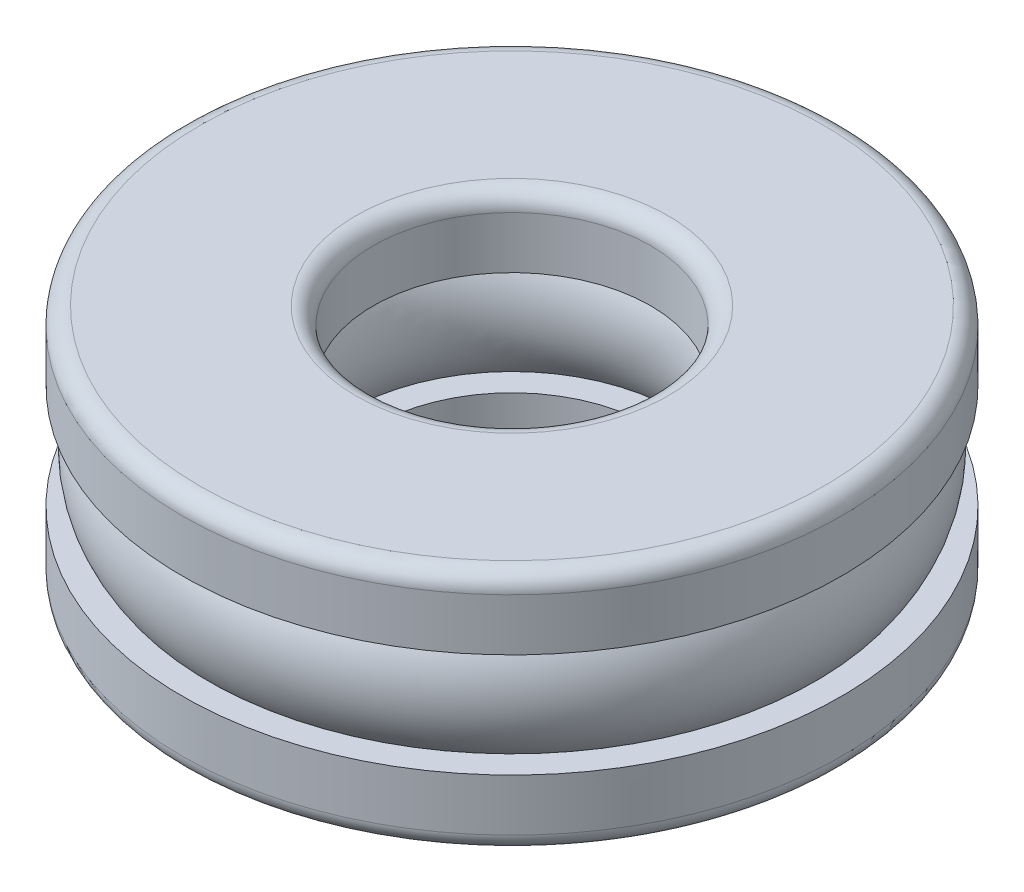
ISO-10303-21;
HEADER;
FILE_DESCRIPTION(('STEP AP214'),'2;1');
FILE_NAME('part.step','',(''),(''),'','','');
FILE_SCHEMA(('AUTOMOTIVE_DESIGN { 1 0 10303 214 1 1 1 1 }'));
ENDSEC;
DATA;
#1=APPLICATION_CONTEXT('core data for automotive mechanical design processes');
#2=APPLICATION_PROTOCOL_DEFINITION('international standard','automotive_design',2000,#1);
#3=PRODUCT_CONTEXT('',#1,'mechanical');
#4=PRODUCT('Part','Part','',(#3));
#5=PRODUCT_RELATED_PRODUCT_CATEGORY('part','',(#4));
#6=PRODUCT_DEFINITION_FORMATION('','',#4);
#7=PRODUCT_DEFINITION_CONTEXT('part definition',#1,'design');
#8=PRODUCT_DEFINITION('design','',#6,#7);
#9=PRODUCT_DEFINITION_SHAPE('','',#8);
#10=(LENGTH_UNIT() NAMED_UNIT(*) SI_UNIT(.MILLI.,.METRE.));
#11=(NAMED_UNIT(*) PLANE_ANGLE_UNIT() SI_UNIT($,.RADIAN.));
#12=(NAMED_UNIT(*) SI_UNIT($,.STERADIAN.) SOLID_ANGLE_UNIT());
#13=UNCERTAINTY_MEASURE_WITH_UNIT(LENGTH_MEASURE(1.E-05),#10,'distance_accuracy_value','');
#14=(GEOMETRIC_REPRESENTATION_CONTEXT(3) GLOBAL_UNCERTAINTY_ASSIGNED_CONTEXT((#13)) GLOBAL_UNIT_ASSIGNED_CONTEXT((#10,
#11,#12)) REPRESENTATION_CONTEXT('',''));
#15=CARTESIAN_POINT('',(0.,0.,0.));
#16=DIRECTION('',(0.,0.,1.));
#17=DIRECTION('',(1.,0.,0.));
#18=AXIS2_PLACEMENT_3D('',#15,#16,#17);
#19=CARTESIAN_POINT('',(0.,1.5,0.));
#20=DIRECTION('',(0.,1.,0.));
#21=DIRECTION('',(0.,0.,1.));
#22=AXIS2_PLACEMENT_3D('',#19,#20,#21);
#23=PLANE('',#22);
#24=CARTESIAN_POINT('',(0.,1.5,0.));
#25=DIRECTION('',(0.,-1.,0.));
#26=DIRECTION('',(0.,0.,-1.));
#27=AXIS2_PLACEMENT_3D('',#24,#25,#26);
#28=CIRCLE('',#27,8.75);
#29=CARTESIAN_POINT('',(0.,1.5,-8.75));
#30=VERTEX_POINT('',#29);
#31=EDGE_CURVE('E64',#30,#30,#28,.T.);
#32=ORIENTED_EDGE('',*,*,#31,.F.);
#33=EDGE_LOOP('',(#32));
#34=FACE_BOUND('',#33,.T.);
#35=CARTESIAN_POINT('',(0.,1.5,0.));
#36=DIRECTION('',(0.,-1.,0.));
#37=DIRECTION('',(0.,0.,-1.));
#38=AXIS2_PLACEMENT_3D('',#35,#36,#37);
#39=CIRCLE('',#38,9.5);
#40=CARTESIAN_POINT('',(0.,1.5,-9.5));
#41=VERTEX_POINT('',#40);
#42=EDGE_CURVE('E85',#41,#41,#39,.T.);
#43=ORIENTED_EDGE('',*,*,#42,.T.);
#44=EDGE_LOOP('',(#43));
#45=FACE_BOUND('',#44,.T.);
#46=ADVANCED_FACE('F32',(#34,#45),#23,.F.);
#47=CARTESIAN_POINT('',(0.,0.,0.));
#48=DIRECTION('',(0.,-1.,0.));
#49=DIRECTION('',(0.,0.,-1.));
#50=AXIS2_PLACEMENT_3D('',#47,#48,#49);
#51=TOROIDAL_SURFACE('',#50,6.75,2.5);
#52=CARTESIAN_POINT('',(0.,-1.5,0.));
#53=DIRECTION('',(0.,-1.,0.));
#54=DIRECTION('',(0.,0.,-1.));
#55=AXIS2_PLACEMENT_3D('',#52,#53,#54);
#56=CIRCLE('',#55,8.75);
#57=CARTESIAN_POINT('',(0.,-1.5,-8.75));
#58=VERTEX_POINT('',#57);
#59=EDGE_CURVE('E67',#58,#58,#56,.T.);
#60=ORIENTED_EDGE('',*,*,#59,.F.);
#61=EDGE_LOOP('',(#60));
#62=FACE_BOUND('',#61,.T.);
#63=ORIENTED_EDGE('',*,*,#31,.T.);
#64=EDGE_LOOP('',(#63));
#65=FACE_BOUND('',#64,.T.);
#66=ADVANCED_FACE('F106',(#62,#65),#51,.T.);
#67=CARTESIAN_POINT('',(0.,-1.5,0.));
#68=DIRECTION('',(0.,1.,0.));
#69=DIRECTION('',(0.,0.,1.));
#70=AXIS2_PLACEMENT_3D('',#67,#68,#69);
#71=PLANE('',#70);
#72=ORIENTED_EDGE('',*,*,#59,.T.);
#73=EDGE_LOOP('',(#72));
#74=FACE_BOUND('',#73,.T.);
#75=CARTESIAN_POINT('',(0.,-1.5,0.));
#76=DIRECTION('',(0.,-1.,0.));
#77=DIRECTION('',(0.,0.,-1.));
#78=AXIS2_PLACEMENT_3D('',#75,#76,#77);
#79=CIRCLE('',#78,9.5);
#80=CARTESIAN_POINT('',(0.,-1.5,-9.5));
#81=VERTEX_POINT('',#80);
#82=EDGE_CURVE('E70',#81,#81,#79,.T.);
#83=ORIENTED_EDGE('',*,*,#82,.F.);
#84=EDGE_LOOP('',(#83));
#85=FACE_BOUND('',#84,.T.);
#86=ADVANCED_FACE('F113',(#74,#85),#71,.T.);
#87=CARTESIAN_POINT('',(0.,0.,0.));
#88=DIRECTION('',(0.,-1.,0.));
#89=DIRECTION('',(0.,0.,-1.));
#90=AXIS2_PLACEMENT_3D('',#87,#88,#89);
#91=CYLINDRICAL_SURFACE('',#90,9.5);
#92=CARTESIAN_POINT('',(0.,-3.,0.));
#93=DIRECTION('',(0.,1.,0.));
#94=DIRECTION('',(0.,0.,1.));
#95=AXIS2_PLACEMENT_3D('',#92,#93,#94);
#96=CIRCLE('',#95,9.5);
#97=CARTESIAN_POINT('',(0.,-3.,9.5));
#98=VERTEX_POINT('',#97);
#99=EDGE_CURVE('E55',#98,#98,#96,.T.);
#100=ORIENTED_EDGE('',*,*,#99,.T.);
#101=EDGE_LOOP('',(#100));
#102=FACE_BOUND('',#101,.T.);
#103=ORIENTED_EDGE('',*,*,#82,.T.);
#104=EDGE_LOOP('',(#103));
#105=FACE_BOUND('',#104,.T.);
#106=ADVANCED_FACE('F144',(#102,#105),#91,.T.);
#107=CARTESIAN_POINT('',(0.,-3.5,0.));
#108=DIRECTION('',(0.,1.,0.));
#109=DIRECTION('',(0.,0.,1.));
#110=AXIS2_PLACEMENT_3D('',#107,#108,#109);
#111=PLANE('',#110);
#112=CARTESIAN_POINT('',(0.,-3.5,0.));
#113=DIRECTION('',(0.,1.,0.));
#114=DIRECTION('',(0.,0.,1.));
#115=AXIS2_PLACEMENT_3D('',#112,#113,#114);
#116=CIRCLE('',#115,9.);
#117=CARTESIAN_POINT('',(0.,-3.5,9.));
#118=VERTEX_POINT('',#117);
#119=EDGE_CURVE('E58',#118,#118,#116,.F.);
#120=ORIENTED_EDGE('',*,*,#119,.T.);
#121=EDGE_LOOP('',(#120));
#122=FACE_BOUND('',#121,.T.);
#123=CARTESIAN_POINT('',(0.,-3.5,0.));
#124=DIRECTION('',(0.,1.,0.));
#125=DIRECTION('',(0.,0.,1.));
#126=AXIS2_PLACEMENT_3D('',#123,#124,#125);
#127=CIRCLE('',#126,4.5);
#128=CARTESIAN_POINT('',(0.,-3.5,4.5));
#129=VERTEX_POINT('',#128);
#130=EDGE_CURVE('E61',#129,#129,#127,.T.);
#131=ORIENTED_EDGE('',*,*,#130,.T.);
#132=EDGE_LOOP('',(#131));
#133=FACE_BOUND('',#132,.T.);
#134=ADVANCED_FACE('F140',(#122,#133),#111,.F.);
#135=CARTESIAN_POINT('',(0.,0.,0.));
#136=DIRECTION('',(0.,-1.,0.));
#137=DIRECTION('',(0.,0.,-1.));
#138=AXIS2_PLACEMENT_3D('',#135,#136,#137);
#139=CYLINDRICAL_SURFACE('',#138,4.);
#140=CARTESIAN_POINT('',(0.,-3.,0.));
#141=DIRECTION('',(0.,1.,0.));
#142=DIRECTION('',(0.,0.,1.));
#143=AXIS2_PLACEMENT_3D('',#140,#141,#142);
#144=CIRCLE('',#143,4.);
#145=CARTESIAN_POINT('',(0.,-3.,4.));
#146=VERTEX_POINT('',#145);
#147=EDGE_CURVE('E52',#146,#146,#144,.F.);
#148=ORIENTED_EDGE('',*,*,#147,.T.);
#149=EDGE_LOOP('',(#148));
#150=FACE_BOUND('',#149,.T.);
#151=CARTESIAN_POINT('',(0.,-1.5,0.));
#152=DIRECTION('',(0.,-1.,0.));
#153=DIRECTION('',(0.,0.,-1.));
#154=AXIS2_PLACEMENT_3D('',#151,#152,#153);
#155=CIRCLE('',#154,4.);
#156=CARTESIAN_POINT('',(0.,-1.5,-4.));
#157=VERTEX_POINT('',#156);
#158=EDGE_CURVE('E73',#157,#157,#155,.T.);
#159=ORIENTED_EDGE('',*,*,#158,.F.);
#160=EDGE_LOOP('',(#159));
#161=FACE_BOUND('',#160,.T.);
#162=ADVANCED_FACE('F134',(#150,#161),#139,.F.);
#163=ORIENTED_EDGE('',*,*,#158,.T.);
#164=EDGE_LOOP('',(#163));
#165=FACE_BOUND('',#164,.T.);
#166=CARTESIAN_POINT('',(0.,-1.5,0.));
#167=DIRECTION('',(0.,-1.,0.));
#168=DIRECTION('',(0.,0.,-1.));
#169=AXIS2_PLACEMENT_3D('',#166,#167,#168);
#170=CIRCLE('',#169,4.75);
#171=CARTESIAN_POINT('',(0.,-1.5,-4.75));
#172=VERTEX_POINT('',#171);
#173=EDGE_CURVE('E76',#172,#172,#170,.T.);
#174=ORIENTED_EDGE('',*,*,#173,.F.);
#175=EDGE_LOOP('',(#174));
#176=FACE_BOUND('',#175,.T.);
#177=ADVANCED_FACE('F125',(#165,#176),#71,.T.);
#178=CARTESIAN_POINT('',(0.,1.5,0.));
#179=DIRECTION('',(0.,-1.,0.));
#180=DIRECTION('',(0.,0.,-1.));
#181=AXIS2_PLACEMENT_3D('',#178,#179,#180);
#182=CIRCLE('',#181,4.75);
#183=CARTESIAN_POINT('',(0.,1.5,-4.75));
#184=VERTEX_POINT('',#183);
#185=EDGE_CURVE('E79',#184,#184,#182,.T.);
#186=ORIENTED_EDGE('',*,*,#185,.F.);
#187=EDGE_LOOP('',(#186));
#188=FACE_BOUND('',#187,.T.);
#189=ORIENTED_EDGE('',*,*,#173,.T.);
#190=EDGE_LOOP('',(#189));
#191=FACE_BOUND('',#190,.T.);
#192=ADVANCED_FACE('F116',(#188,#191),#51,.T.);
#193=CARTESIAN_POINT('',(0.,1.5,0.));
#194=DIRECTION('',(0.,-1.,0.));
#195=DIRECTION('',(0.,0.,-1.));
#196=AXIS2_PLACEMENT_3D('',#193,#194,#195);
#197=CIRCLE('',#196,4.);
#198=CARTESIAN_POINT('',(0.,1.5,-4.));
#199=VERTEX_POINT('',#198);
#200=EDGE_CURVE('E82',#199,#199,#197,.T.);
#201=ORIENTED_EDGE('',*,*,#200,.F.);
#202=EDGE_LOOP('',(#201));
#203=FACE_BOUND('',#202,.T.);
#204=ORIENTED_EDGE('',*,*,#185,.T.);
#205=EDGE_LOOP('',(#204));
#206=FACE_BOUND('',#205,.T.);
#207=ADVANCED_FACE('F109',(#203,#206),#23,.F.);
#208=CARTESIAN_POINT('',(0.,0.,0.));
#209=DIRECTION('',(0.,-1.,0.));
#210=DIRECTION('',(0.,0.,-1.));
#211=AXIS2_PLACEMENT_3D('',#208,#209,#210);
#212=CYLINDRICAL_SURFACE('',#211,4.);
#213=CARTESIAN_POINT('',(0.,3.,0.));
#214=DIRECTION('',(0.,1.,0.));
#215=DIRECTION('',(0.,0.,1.));
#216=AXIS2_PLACEMENT_3D('',#213,#214,#215);
#217=CIRCLE('',#216,4.);
#218=CARTESIAN_POINT('',(0.,3.,4.));
#219=VERTEX_POINT('',#218);
#220=EDGE_CURVE('E10',#219,#219,#217,.T.);
#221=ORIENTED_EDGE('',*,*,#220,.T.);
#222=EDGE_LOOP('',(#221));
#223=FACE_BOUND('',#222,.T.);
#224=ORIENTED_EDGE('',*,*,#200,.T.);
#225=EDGE_LOOP('',(#224));
#226=FACE_BOUND('',#225,.T.);
#227=ADVANCED_FACE('F103',(#223,#226),#212,.F.);
#228=CARTESIAN_POINT('',(0.,3.5,0.));
#229=DIRECTION('',(0.,1.,0.));
#230=DIRECTION('',(0.,0.,1.));
#231=AXIS2_PLACEMENT_3D('',#228,#229,#230);
#232=PLANE('',#231);
#233=CARTESIAN_POINT('',(0.,3.5,0.));
#234=DIRECTION('',(0.,1.,0.));
#235=DIRECTION('',(0.,0.,1.));
#236=AXIS2_PLACEMENT_3D('',#233,#234,#235);
#237=CIRCLE('',#236,9.);
#238=CARTESIAN_POINT('',(0.,3.5,9.));
#239=VERTEX_POINT('',#238);
#240=EDGE_CURVE('E39',#239,#239,#237,.T.);
#241=ORIENTED_EDGE('',*,*,#240,.T.);
#242=EDGE_LOOP('',(#241));
#243=FACE_BOUND('',#242,.T.);
#244=CARTESIAN_POINT('',(0.,3.5,0.));
#245=DIRECTION('',(0.,1.,0.));
#246=DIRECTION('',(0.,0.,1.));
#247=AXIS2_PLACEMENT_3D('',#244,#245,#246);
#248=CIRCLE('',#247,4.5);
#249=CARTESIAN_POINT('',(0.,3.5,4.5));
#250=VERTEX_POINT('',#249);
#251=EDGE_CURVE('E43',#250,#250,#248,.F.);
#252=ORIENTED_EDGE('',*,*,#251,.T.);
#253=EDGE_LOOP('',(#252));
#254=FACE_BOUND('',#253,.T.);
#255=ADVANCED_FACE('F93',(#243,#254),#232,.T.);
#256=CARTESIAN_POINT('',(0.,0.,0.));
#257=DIRECTION('',(0.,-1.,0.));
#258=DIRECTION('',(0.,0.,-1.));
#259=AXIS2_PLACEMENT_3D('',#256,#257,#258);
#260=CYLINDRICAL_SURFACE('',#259,9.5);
#261=CARTESIAN_POINT('',(0.,3.,0.));
#262=DIRECTION('',(0.,1.,0.));
#263=DIRECTION('',(0.,0.,1.));
#264=AXIS2_PLACEMENT_3D('',#261,#262,#263);
#265=CIRCLE('',#264,9.5);
#266=CARTESIAN_POINT('',(0.,3.,9.5));
#267=VERTEX_POINT('',#266);
#268=EDGE_CURVE('E47',#267,#267,#265,.F.);
#269=ORIENTED_EDGE('',*,*,#268,.T.);
#270=EDGE_LOOP('',(#269));
#271=FACE_BOUND('',#270,.T.);
#272=ORIENTED_EDGE('',*,*,#42,.F.);
#273=EDGE_LOOP('',(#272));
#274=FACE_BOUND('',#273,.T.);
#275=ADVANCED_FACE('F90',(#271,#274),#260,.T.);
#276=CARTESIAN_POINT('',(0.,-3.,0.));
#277=DIRECTION('',(0.,1.,0.));
#278=DIRECTION('',(0.,0.,1.));
#279=AXIS2_PLACEMENT_3D('',#276,#277,#278);
#280=TOROIDAL_SURFACE('',#279,9.,0.5);
#281=ORIENTED_EDGE('',*,*,#99,.F.);
#282=EDGE_LOOP('',(#281));
#283=FACE_BOUND('',#282,.T.);
#284=ORIENTED_EDGE('',*,*,#119,.F.);
#285=EDGE_LOOP('',(#284));
#286=FACE_BOUND('',#285,.T.);
#287=ADVANCED_FACE('F92',(#283,#286),#280,.T.);
#288=CARTESIAN_POINT('',(0.,-3.,0.));
#289=DIRECTION('',(0.,1.,0.));
#290=DIRECTION('',(0.,0.,1.));
#291=AXIS2_PLACEMENT_3D('',#288,#289,#290);
#292=TOROIDAL_SURFACE('',#291,4.5,0.5);
#293=ORIENTED_EDGE('',*,*,#130,.F.);
#294=EDGE_LOOP('',(#293));
#295=FACE_BOUND('',#294,.T.);
#296=ORIENTED_EDGE('',*,*,#147,.F.);
#297=EDGE_LOOP('',(#296));
#298=FACE_BOUND('',#297,.T.);
#299=ADVANCED_FACE('F100',(#295,#298),#292,.T.);
#300=CARTESIAN_POINT('',(0.,3.,0.));
#301=DIRECTION('',(0.,1.,0.));
#302=DIRECTION('',(0.,0.,1.));
#303=AXIS2_PLACEMENT_3D('',#300,#301,#302);
#304=TOROIDAL_SURFACE('',#303,9.,0.5);
#305=ORIENTED_EDGE('',*,*,#240,.F.);
#306=EDGE_LOOP('',(#305));
#307=FACE_BOUND('',#306,.T.);
#308=ORIENTED_EDGE('',*,*,#268,.F.);
#309=EDGE_LOOP('',(#308));
#310=FACE_BOUND('',#309,.T.);
#311=ADVANCED_FACE('F163',(#307,#310),#304,.T.);
#312=CARTESIAN_POINT('',(0.,3.,0.));
#313=DIRECTION('',(0.,1.,0.));
#314=DIRECTION('',(0.,0.,1.));
#315=AXIS2_PLACEMENT_3D('',#312,#313,#314);
#316=TOROIDAL_SURFACE('',#315,4.5,0.5);
#317=ORIENTED_EDGE('',*,*,#220,.F.);
#318=EDGE_LOOP('',(#317));
#319=FACE_BOUND('',#318,.T.);
#320=ORIENTED_EDGE('',*,*,#251,.F.);
#321=EDGE_LOOP('',(#320));
#322=FACE_BOUND('',#321,.T.);
#323=ADVANCED_FACE('F34',(#319,#322),#316,.T.);
#324=CLOSED_SHELL('',(#46,#66,#86,#106,#134,#162,#177,#192,#207,#227,#255,#275,#287,#299,#311,#323));
#325=MANIFOLD_SOLID_BREP('B2',#324);
#326=ADVANCED_BREP_SHAPE_REPRESENTATION('',(#18,#325),#14);
#327=SHAPE_DEFINITION_REPRESENTATION(#9,#326);
ENDSEC;
END-ISO-10303-21;
